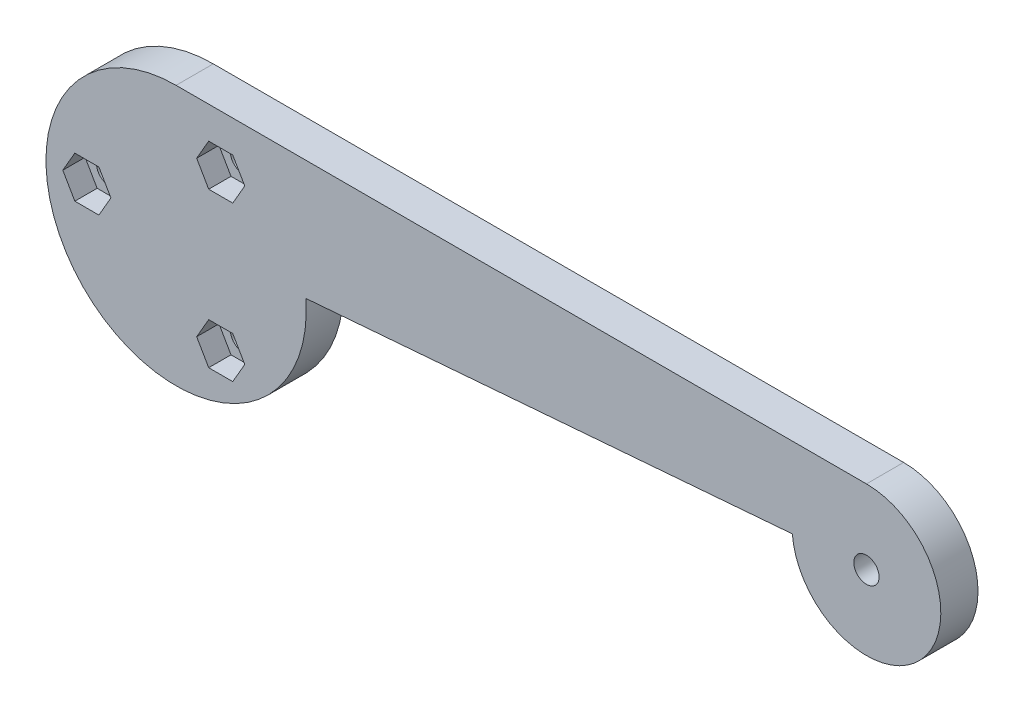
ISO-10303-21;
HEADER;
FILE_DESCRIPTION(('STEP AP214'),'2;1');
FILE_NAME('part.step','',(''),(''),'','','');
FILE_SCHEMA(('AUTOMOTIVE_DESIGN { 1 0 10303 214 1 1 1 1 }'));
ENDSEC;
DATA;
#1=APPLICATION_CONTEXT('core data for automotive mechanical design processes');
#2=APPLICATION_PROTOCOL_DEFINITION('international standard','automotive_design',2000,#1);
#3=PRODUCT_CONTEXT('',#1,'mechanical');
#4=PRODUCT('Part','Part','',(#3));
#5=PRODUCT_RELATED_PRODUCT_CATEGORY('part','',(#4));
#6=PRODUCT_DEFINITION_FORMATION('','',#4);
#7=PRODUCT_DEFINITION_CONTEXT('part definition',#1,'design');
#8=PRODUCT_DEFINITION('design','',#6,#7);
#9=PRODUCT_DEFINITION_SHAPE('','',#8);
#10=(LENGTH_UNIT() NAMED_UNIT(*) SI_UNIT(.MILLI.,.METRE.));
#11=(NAMED_UNIT(*) PLANE_ANGLE_UNIT() SI_UNIT($,.RADIAN.));
#12=(NAMED_UNIT(*) SI_UNIT($,.STERADIAN.) SOLID_ANGLE_UNIT());
#13=UNCERTAINTY_MEASURE_WITH_UNIT(LENGTH_MEASURE(1.E-05),#10,'distance_accuracy_value','');
#14=(GEOMETRIC_REPRESENTATION_CONTEXT(3) GLOBAL_UNCERTAINTY_ASSIGNED_CONTEXT((#13)) GLOBAL_UNIT_ASSIGNED_CONTEXT((#10,
#11,#12)) REPRESENTATION_CONTEXT('',''));
#15=CARTESIAN_POINT('',(0.,0.,0.));
#16=DIRECTION('',(0.,0.,1.));
#17=DIRECTION('',(1.,0.,0.));
#18=AXIS2_PLACEMENT_3D('',#15,#16,#17);
#19=CARTESIAN_POINT('',(5.9999999999999,-10.3923048454133,5.));
#20=DIRECTION('',(0.,0.,1.));
#21=DIRECTION('',(1.,0.,0.));
#22=AXIS2_PLACEMENT_3D('',#19,#20,#21);
#23=CYLINDRICAL_SURFACE('',#22,1.69999999999999);
#24=CARTESIAN_POINT('',(5.9999999999999,-10.3923048454133,0.));
#25=DIRECTION('',(0.,0.,1.));
#26=DIRECTION('',(1.,0.,0.));
#27=AXIS2_PLACEMENT_3D('',#24,#25,#26);
#28=CIRCLE('',#27,1.7);
#29=CARTESIAN_POINT('',(7.6999999999999,-10.3923048454133,0.));
#30=VERTEX_POINT('',#29);
#31=EDGE_CURVE('E289',#30,#30,#28,.T.);
#32=ORIENTED_EDGE('',*,*,#31,.F.);
#33=EDGE_LOOP('',(#32));
#34=FACE_BOUND('',#33,.T.);
#35=CARTESIAN_POINT('',(5.9999999999999,-10.3923048454133,2.));
#36=DIRECTION('',(0.,0.,1.));
#37=DIRECTION('',(1.,0.,0.));
#38=AXIS2_PLACEMENT_3D('',#35,#36,#37);
#39=CIRCLE('',#38,1.69999999999999);
#40=CARTESIAN_POINT('',(7.6999999999999,-10.3923048454133,2.));
#41=VERTEX_POINT('',#40);
#42=EDGE_CURVE('E37',#41,#41,#39,.F.);
#43=ORIENTED_EDGE('',*,*,#42,.F.);
#44=EDGE_LOOP('',(#43));
#45=FACE_BOUND('',#44,.T.);
#46=ADVANCED_FACE('F33',(#34,#45),#23,.F.);
#47=CARTESIAN_POINT('',(6.00000000000005,10.3923048454132,5.));
#48=DIRECTION('',(0.,0.,1.));
#49=DIRECTION('',(1.,0.,0.));
#50=AXIS2_PLACEMENT_3D('',#47,#48,#49);
#51=CYLINDRICAL_SURFACE('',#50,1.69999999999999);
#52=CARTESIAN_POINT('',(6.00000000000005,10.3923048454132,0.));
#53=DIRECTION('',(0.,0.,1.));
#54=DIRECTION('',(1.,0.,0.));
#55=AXIS2_PLACEMENT_3D('',#52,#53,#54);
#56=CIRCLE('',#55,1.7);
#57=CARTESIAN_POINT('',(7.70000000000005,10.3923048454132,0.));
#58=VERTEX_POINT('',#57);
#59=EDGE_CURVE('E292',#58,#58,#56,.T.);
#60=ORIENTED_EDGE('',*,*,#59,.F.);
#61=EDGE_LOOP('',(#60));
#62=FACE_BOUND('',#61,.T.);
#63=CARTESIAN_POINT('',(6.00000000000005,10.3923048454132,2.));
#64=DIRECTION('',(0.,0.,1.));
#65=DIRECTION('',(1.,0.,0.));
#66=AXIS2_PLACEMENT_3D('',#63,#64,#65);
#67=CIRCLE('',#66,1.69999999999999);
#68=CARTESIAN_POINT('',(7.70000000000004,10.3923048454132,2.));
#69=VERTEX_POINT('',#68);
#70=EDGE_CURVE('E279',#69,#69,#67,.F.);
#71=ORIENTED_EDGE('',*,*,#70,.F.);
#72=EDGE_LOOP('',(#71));
#73=FACE_BOUND('',#72,.T.);
#74=ADVANCED_FACE('F379',(#62,#73),#51,.F.);
#75=CARTESIAN_POINT('',(-12.,0.,5.));
#76=DIRECTION('',(0.,0.,1.));
#77=DIRECTION('',(1.,0.,0.));
#78=AXIS2_PLACEMENT_3D('',#75,#76,#77);
#79=CYLINDRICAL_SURFACE('',#78,1.69999999999999);
#80=CARTESIAN_POINT('',(-12.,0.,0.));
#81=DIRECTION('',(0.,0.,1.));
#82=DIRECTION('',(1.,0.,0.));
#83=AXIS2_PLACEMENT_3D('',#80,#81,#82);
#84=CIRCLE('',#83,1.7);
#85=CARTESIAN_POINT('',(-10.3,0.,0.));
#86=VERTEX_POINT('',#85);
#87=EDGE_CURVE('E344',#86,#86,#84,.T.);
#88=ORIENTED_EDGE('',*,*,#87,.F.);
#89=EDGE_LOOP('',(#88));
#90=FACE_BOUND('',#89,.T.);
#91=CARTESIAN_POINT('',(-12.,0.,2.));
#92=DIRECTION('',(0.,0.,1.));
#93=DIRECTION('',(1.,0.,0.));
#94=AXIS2_PLACEMENT_3D('',#91,#92,#93);
#95=CIRCLE('',#94,1.69999999999999);
#96=CARTESIAN_POINT('',(-10.3,0.,2.));
#97=VERTEX_POINT('',#96);
#98=EDGE_CURVE('E333',#97,#97,#95,.F.);
#99=ORIENTED_EDGE('',*,*,#98,.F.);
#100=EDGE_LOOP('',(#99));
#101=FACE_BOUND('',#100,.T.);
#102=ADVANCED_FACE('F381',(#90,#101),#79,.F.);
#103=CARTESIAN_POINT('',(0.,0.,5.));
#104=DIRECTION('',(0.,0.,-1.));
#105=DIRECTION('',(-1.,0.,0.));
#106=AXIS2_PLACEMENT_3D('',#103,#104,#105);
#107=CYLINDRICAL_SURFACE('',#106,17.5);
#108=CARTESIAN_POINT('',(0.,0.,0.));
#109=DIRECTION('',(0.,0.,1.));
#110=DIRECTION('',(1.,0.,0.));
#111=AXIS2_PLACEMENT_3D('',#108,#109,#110);
#112=CIRCLE('',#111,17.5);
#113=CARTESIAN_POINT('',(0.,17.5,0.));
#114=VERTEX_POINT('',#113);
#115=CARTESIAN_POINT('',(17.4431573607474,1.40934782371281,0.));
#116=VERTEX_POINT('',#115);
#117=EDGE_CURVE('E347',#114,#116,#112,.T.);
#118=ORIENTED_EDGE('',*,*,#117,.T.);
#119=DIRECTION('',(0.,0.,-1.));
#120=VECTOR('',#119,1.);
#121=CARTESIAN_POINT('',(17.4431573607474,1.40934782371281,5.));
#122=LINE('',#121,#120);
#123=CARTESIAN_POINT('',(17.4431573607474,1.40934782371281,5.));
#124=VERTEX_POINT('',#123);
#125=EDGE_CURVE('E11',#124,#116,#122,.T.);
#126=ORIENTED_EDGE('',*,*,#125,.F.);
#127=CARTESIAN_POINT('',(0.,0.,5.));
#128=DIRECTION('',(0.,0.,1.));
#129=DIRECTION('',(1.,0.,0.));
#130=AXIS2_PLACEMENT_3D('',#127,#128,#129);
#131=CIRCLE('',#130,17.5);
#132=CARTESIAN_POINT('',(0.,17.5,5.));
#133=VERTEX_POINT('',#132);
#134=EDGE_CURVE('E348',#133,#124,#131,.T.);
#135=ORIENTED_EDGE('',*,*,#134,.F.);
#136=DIRECTION('',(0.,0.,-1.));
#137=VECTOR('',#136,1.);
#138=CARTESIAN_POINT('',(0.,17.5,5.));
#139=LINE('',#138,#137);
#140=EDGE_CURVE('E358',#133,#114,#139,.T.);
#141=ORIENTED_EDGE('',*,*,#140,.T.);
#142=EDGE_LOOP('',(#118,#126,#135,#141));
#143=FACE_BOUND('',#142,.T.);
#144=ADVANCED_FACE('F35',(#143),#107,.T.);
#145=CARTESIAN_POINT('',(17.4431573607474,1.40934782371281,5.));
#146=DIRECTION('',(-0.0805341613550145,0.996751849185566,0.));
#147=DIRECTION('',(-0.996751849185566,-0.0805341613550145,0.));
#148=AXIS2_PLACEMENT_3D('',#145,#146,#147);
#149=PLANE('',#148);
#150=DIRECTION('',(0.996751849185565,0.0805341613550145,0.));
#151=VECTOR('',#150,1.);
#152=CARTESIAN_POINT('',(17.4431573607474,1.40934782371281,0.));
#153=LINE('',#152,#151);
#154=CARTESIAN_POINT('',(82.8581686837672,6.69465838644989,0.));
#155=VERTEX_POINT('',#154);
#156=EDGE_CURVE('E361',#116,#155,#153,.T.);
#157=ORIENTED_EDGE('',*,*,#156,.T.);
#158=DIRECTION('',(0.,0.,-1.));
#159=VECTOR('',#158,1.);
#160=CARTESIAN_POINT('',(82.8581686837672,6.69465838644989,5.));
#161=LINE('',#160,#159);
#162=CARTESIAN_POINT('',(82.8581686837672,6.69465838644989,5.));
#163=VERTEX_POINT('',#162);
#164=EDGE_CURVE('E42',#163,#155,#161,.T.);
#165=ORIENTED_EDGE('',*,*,#164,.F.);
#166=DIRECTION('',(0.996751849185565,0.0805341613550145,0.));
#167=VECTOR('',#166,1.);
#168=CARTESIAN_POINT('',(17.4431573607474,1.40934782371281,5.));
#169=LINE('',#168,#167);
#170=EDGE_CURVE('E351',#124,#163,#169,.T.);
#171=ORIENTED_EDGE('',*,*,#170,.F.);
#172=ORIENTED_EDGE('',*,*,#125,.T.);
#173=EDGE_LOOP('',(#157,#165,#171,#172));
#174=FACE_BOUND('',#173,.T.);
#175=ADVANCED_FACE('F437',(#174),#149,.F.);
#176=CARTESIAN_POINT('',(92.8256871756229,7.5,5.));
#177=DIRECTION('',(0.,0.,-1.));
#178=DIRECTION('',(-1.,0.,0.));
#179=AXIS2_PLACEMENT_3D('',#176,#177,#178);
#180=CYLINDRICAL_SURFACE('',#179,10.);
#181=CARTESIAN_POINT('',(92.8256871756229,7.5,0.));
#182=DIRECTION('',(0.,0.,1.));
#183=DIRECTION('',(-1.,0.,0.));
#184=AXIS2_PLACEMENT_3D('',#181,#182,#183);
#185=CIRCLE('',#184,10.);
#186=CARTESIAN_POINT('',(92.8256871756229,17.5,0.));
#187=VERTEX_POINT('',#186);
#188=EDGE_CURVE('E363',#155,#187,#185,.T.);
#189=ORIENTED_EDGE('',*,*,#188,.T.);
#190=DIRECTION('',(0.,0.,-1.));
#191=VECTOR('',#190,1.);
#192=CARTESIAN_POINT('',(92.8256871756229,17.5,5.));
#193=LINE('',#192,#191);
#194=CARTESIAN_POINT('',(92.8256871756229,17.5,5.));
#195=VERTEX_POINT('',#194);
#196=EDGE_CURVE('E368',#195,#187,#193,.T.);
#197=ORIENTED_EDGE('',*,*,#196,.F.);
#198=CARTESIAN_POINT('',(92.8256871756229,7.5,5.));
#199=DIRECTION('',(0.,0.,1.));
#200=DIRECTION('',(-1.,0.,0.));
#201=AXIS2_PLACEMENT_3D('',#198,#199,#200);
#202=CIRCLE('',#201,10.);
#203=EDGE_CURVE('E354',#163,#195,#202,.T.);
#204=ORIENTED_EDGE('',*,*,#203,.F.);
#205=ORIENTED_EDGE('',*,*,#164,.T.);
#206=EDGE_LOOP('',(#189,#197,#204,#205));
#207=FACE_BOUND('',#206,.T.);
#208=ADVANCED_FACE('F434',(#207),#180,.T.);
#209=CARTESIAN_POINT('',(0.,17.5,5.));
#210=DIRECTION('',(0.,-1.,0.));
#211=DIRECTION('',(0.,0.,-1.));
#212=AXIS2_PLACEMENT_3D('',#209,#210,#211);
#213=PLANE('',#212);
#214=DIRECTION('',(-1.,0.,0.));
#215=VECTOR('',#214,1.);
#216=CARTESIAN_POINT('',(0.,17.5,0.));
#217=LINE('',#216,#215);
#218=EDGE_CURVE('E352',#187,#114,#217,.T.);
#219=ORIENTED_EDGE('',*,*,#218,.T.);
#220=ORIENTED_EDGE('',*,*,#140,.F.);
#221=DIRECTION('',(-1.,0.,0.));
#222=VECTOR('',#221,1.);
#223=CARTESIAN_POINT('',(0.,17.5,5.));
#224=LINE('',#223,#222);
#225=EDGE_CURVE('E356',#195,#133,#224,.T.);
#226=ORIENTED_EDGE('',*,*,#225,.F.);
#227=ORIENTED_EDGE('',*,*,#196,.T.);
#228=EDGE_LOOP('',(#219,#220,#226,#227));
#229=FACE_BOUND('',#228,.T.);
#230=ADVANCED_FACE('F427',(#229),#213,.F.);
#231=CARTESIAN_POINT('',(0.,0.,5.));
#232=DIRECTION('',(0.,0.,1.));
#233=DIRECTION('',(1.,0.,0.));
#234=AXIS2_PLACEMENT_3D('',#231,#232,#233);
#235=PLANE('',#234);
#236=CARTESIAN_POINT('',(92.8256871756229,7.5,5.));
#237=DIRECTION('',(0.,0.,1.));
#238=DIRECTION('',(1.,0.,0.));
#239=AXIS2_PLACEMENT_3D('',#236,#237,#238);
#240=CIRCLE('',#239,1.69999999999999);
#241=CARTESIAN_POINT('',(94.5256871756229,7.5,5.));
#242=VERTEX_POINT('',#241);
#243=EDGE_CURVE('E681',#242,#242,#240,.T.);
#244=ORIENTED_EDGE('',*,*,#243,.F.);
#245=EDGE_LOOP('',(#244));
#246=FACE_BOUND('',#245,.T.);
#247=DIRECTION('',(-0.500000000000008,-0.866025403784434,0.));
#248=VECTOR('',#247,1.);
#249=CARTESIAN_POINT('',(4.38341924626897,-7.5923048454133,5.));
#250=LINE('',#249,#248);
#251=CARTESIAN_POINT('',(4.38341924626897,-7.5923048454133,5.));
#252=VERTEX_POINT('',#251);
#253=CARTESIAN_POINT('',(2.766838492538,-10.3923048454133,5.));
#254=VERTEX_POINT('',#253);
#255=EDGE_CURVE('E50',#252,#254,#250,.T.);
#256=ORIENTED_EDGE('',*,*,#255,.F.);
#257=DIRECTION('',(-1.,0.,0.));
#258=VECTOR('',#257,1.);
#259=CARTESIAN_POINT('',(7.61658075373088,-7.59230484541333,5.));
#260=LINE('',#259,#258);
#261=CARTESIAN_POINT('',(7.61658075373088,-7.59230484541333,5.));
#262=VERTEX_POINT('',#261);
#263=EDGE_CURVE('E206',#262,#252,#260,.T.);
#264=ORIENTED_EDGE('',*,*,#263,.F.);
#265=DIRECTION('',(-0.499999999999992,0.866025403784443,0.));
#266=VECTOR('',#265,1.);
#267=CARTESIAN_POINT('',(9.23316150746181,-10.3923048454134,5.));
#268=LINE('',#267,#266);
#269=CARTESIAN_POINT('',(9.23316150746181,-10.3923048454134,5.));
#270=VERTEX_POINT('',#269);
#271=EDGE_CURVE('E209',#270,#262,#268,.T.);
#272=ORIENTED_EDGE('',*,*,#271,.F.);
#273=DIRECTION('',(0.500000000000008,0.866025403784434,0.));
#274=VECTOR('',#273,1.);
#275=CARTESIAN_POINT('',(7.61658075373083,-13.1923048454133,5.));
#276=LINE('',#275,#274);
#277=CARTESIAN_POINT('',(7.61658075373083,-13.1923048454133,5.));
#278=VERTEX_POINT('',#277);
#279=EDGE_CURVE('E228',#278,#270,#276,.T.);
#280=ORIENTED_EDGE('',*,*,#279,.F.);
#281=DIRECTION('',(1.,0.,0.));
#282=VECTOR('',#281,1.);
#283=CARTESIAN_POINT('',(4.38341924626893,-13.1923048454133,5.));
#284=LINE('',#283,#282);
#285=CARTESIAN_POINT('',(4.38341924626893,-13.1923048454133,5.));
#286=VERTEX_POINT('',#285);
#287=EDGE_CURVE('E225',#286,#278,#284,.T.);
#288=ORIENTED_EDGE('',*,*,#287,.F.);
#289=DIRECTION('',(0.499999999999992,-0.866025403784443,0.));
#290=VECTOR('',#289,1.);
#291=CARTESIAN_POINT('',(2.766838492538,-10.3923048454133,5.));
#292=LINE('',#291,#290);
#293=EDGE_CURVE('E223',#254,#286,#292,.T.);
#294=ORIENTED_EDGE('',*,*,#293,.F.);
#295=EDGE_LOOP('',(#256,#264,#272,#280,#288,#294));
#296=FACE_BOUND('',#295,.T.);
#297=DIRECTION('',(1.,0.,0.));
#298=VECTOR('',#297,1.);
#299=CARTESIAN_POINT('',(4.38341924626908,7.59230484541324,5.));
#300=LINE('',#299,#298);
#301=CARTESIAN_POINT('',(4.38341924626908,7.59230484541324,5.));
#302=VERTEX_POINT('',#301);
#303=CARTESIAN_POINT('',(7.61658075373099,7.59230484541323,5.));
#304=VERTEX_POINT('',#303);
#305=EDGE_CURVE('E58',#302,#304,#300,.T.);
#306=ORIENTED_EDGE('',*,*,#305,.F.);
#307=DIRECTION('',(0.499999999999995,-0.866025403784441,0.));
#308=VECTOR('',#307,1.);
#309=CARTESIAN_POINT('',(2.76683849253814,10.3923048454133,5.));
#310=LINE('',#309,#308);
#311=CARTESIAN_POINT('',(2.76683849253814,10.3923048454133,5.));
#312=VERTEX_POINT('',#311);
#313=EDGE_CURVE('E246',#312,#302,#310,.T.);
#314=ORIENTED_EDGE('',*,*,#313,.F.);
#315=DIRECTION('',(-0.500000000000004,-0.866025403784436,0.));
#316=VECTOR('',#315,1.);
#317=CARTESIAN_POINT('',(4.38341924626911,13.1923048454132,5.));
#318=LINE('',#317,#316);
#319=CARTESIAN_POINT('',(4.38341924626911,13.1923048454132,5.));
#320=VERTEX_POINT('',#319);
#321=EDGE_CURVE('E272',#320,#312,#318,.T.);
#322=ORIENTED_EDGE('',*,*,#321,.F.);
#323=DIRECTION('',(-1.,0.,0.));
#324=VECTOR('',#323,1.);
#325=CARTESIAN_POINT('',(7.61658075373101,13.1923048454132,5.));
#326=LINE('',#325,#324);
#327=CARTESIAN_POINT('',(7.61658075373101,13.1923048454132,5.));
#328=VERTEX_POINT('',#327);
#329=EDGE_CURVE('E269',#328,#320,#326,.T.);
#330=ORIENTED_EDGE('',*,*,#329,.F.);
#331=DIRECTION('',(-0.499999999999996,0.866025403784441,0.));
#332=VECTOR('',#331,1.);
#333=CARTESIAN_POINT('',(9.23316150746195,10.3923048454132,5.));
#334=LINE('',#333,#332);
#335=CARTESIAN_POINT('',(9.23316150746195,10.3923048454132,5.));
#336=VERTEX_POINT('',#335);
#337=EDGE_CURVE('E266',#336,#328,#334,.T.);
#338=ORIENTED_EDGE('',*,*,#337,.F.);
#339=DIRECTION('',(0.500000000000004,0.866025403784436,0.));
#340=VECTOR('',#339,1.);
#341=CARTESIAN_POINT('',(7.61658075373099,7.59230484541323,5.));
#342=LINE('',#341,#340);
#343=EDGE_CURVE('E263',#304,#336,#342,.T.);
#344=ORIENTED_EDGE('',*,*,#343,.F.);
#345=EDGE_LOOP('',(#306,#314,#322,#330,#338,#344));
#346=FACE_BOUND('',#345,.T.);
#347=DIRECTION('',(-0.500000000000001,0.866025403784438,0.));
#348=VECTOR('',#347,1.);
#349=CARTESIAN_POINT('',(-8.76683849253809,0.,5.));
#350=LINE('',#349,#348);
#351=CARTESIAN_POINT('',(-8.76683849253809,0.,5.));
#352=VERTEX_POINT('',#351);
#353=CARTESIAN_POINT('',(-10.383419246269,2.8,5.));
#354=VERTEX_POINT('',#353);
#355=EDGE_CURVE('E295',#352,#354,#350,.T.);
#356=ORIENTED_EDGE('',*,*,#355,.F.);
#357=DIRECTION('',(0.500000000000001,0.866025403784438,0.));
#358=VECTOR('',#357,1.);
#359=CARTESIAN_POINT('',(-10.383419246269,-2.8,5.));
#360=LINE('',#359,#358);
#361=CARTESIAN_POINT('',(-10.383419246269,-2.8,5.));
#362=VERTEX_POINT('',#361);
#363=EDGE_CURVE('E300',#362,#352,#360,.T.);
#364=ORIENTED_EDGE('',*,*,#363,.F.);
#365=DIRECTION('',(1.,0.,0.));
#366=VECTOR('',#365,1.);
#367=CARTESIAN_POINT('',(-13.616580753731,-2.8,5.));
#368=LINE('',#367,#366);
#369=CARTESIAN_POINT('',(-13.616580753731,-2.8,5.));
#370=VERTEX_POINT('',#369);
#371=EDGE_CURVE('E326',#370,#362,#368,.T.);
#372=ORIENTED_EDGE('',*,*,#371,.F.);
#373=DIRECTION('',(0.5,-0.866025403784438,0.));
#374=VECTOR('',#373,1.);
#375=CARTESIAN_POINT('',(-15.2331615074619,0.,5.));
#376=LINE('',#375,#374);
#377=CARTESIAN_POINT('',(-15.2331615074619,0.,5.));
#378=VERTEX_POINT('',#377);
#379=EDGE_CURVE('E323',#378,#370,#376,.T.);
#380=ORIENTED_EDGE('',*,*,#379,.F.);
#381=DIRECTION('',(-0.5,-0.866025403784438,0.));
#382=VECTOR('',#381,1.);
#383=CARTESIAN_POINT('',(-13.616580753731,2.8,5.));
#384=LINE('',#383,#382);
#385=CARTESIAN_POINT('',(-13.616580753731,2.8,5.));
#386=VERTEX_POINT('',#385);
#387=EDGE_CURVE('E320',#386,#378,#384,.T.);
#388=ORIENTED_EDGE('',*,*,#387,.F.);
#389=DIRECTION('',(-1.,0.,0.));
#390=VECTOR('',#389,1.);
#391=CARTESIAN_POINT('',(-10.383419246269,2.8,5.));
#392=LINE('',#391,#390);
#393=EDGE_CURVE('E317',#354,#386,#392,.T.);
#394=ORIENTED_EDGE('',*,*,#393,.F.);
#395=EDGE_LOOP('',(#356,#364,#372,#380,#388,#394));
#396=FACE_BOUND('',#395,.T.);
#397=ORIENTED_EDGE('',*,*,#134,.T.);
#398=ORIENTED_EDGE('',*,*,#170,.T.);
#399=ORIENTED_EDGE('',*,*,#203,.T.);
#400=ORIENTED_EDGE('',*,*,#225,.T.);
#401=EDGE_LOOP('',(#397,#398,#399,#400));
#402=FACE_BOUND('',#401,.T.);
#403=ADVANCED_FACE('F424',(#246,#296,#346,#396,#402),#235,.T.);
#404=CARTESIAN_POINT('',(0.,0.,0.));
#405=DIRECTION('',(0.,0.,1.));
#406=DIRECTION('',(1.,0.,0.));
#407=AXIS2_PLACEMENT_3D('',#404,#405,#406);
#408=PLANE('',#407);
#409=CARTESIAN_POINT('',(92.8256871756229,7.5,0.));
#410=DIRECTION('',(0.,0.,1.));
#411=DIRECTION('',(1.,0.,0.));
#412=AXIS2_PLACEMENT_3D('',#409,#410,#411);
#413=CIRCLE('',#412,1.69999999999999);
#414=CARTESIAN_POINT('',(94.5256871756229,7.5,0.));
#415=VERTEX_POINT('',#414);
#416=EDGE_CURVE('E212',#415,#415,#413,.T.);
#417=ORIENTED_EDGE('',*,*,#416,.T.);
#418=EDGE_LOOP('',(#417));
#419=FACE_BOUND('',#418,.T.);
#420=ORIENTED_EDGE('',*,*,#31,.T.);
#421=EDGE_LOOP('',(#420));
#422=FACE_BOUND('',#421,.T.);
#423=ORIENTED_EDGE('',*,*,#59,.T.);
#424=EDGE_LOOP('',(#423));
#425=FACE_BOUND('',#424,.T.);
#426=ORIENTED_EDGE('',*,*,#87,.T.);
#427=EDGE_LOOP('',(#426));
#428=FACE_BOUND('',#427,.T.);
#429=ORIENTED_EDGE('',*,*,#117,.F.);
#430=ORIENTED_EDGE('',*,*,#218,.F.);
#431=ORIENTED_EDGE('',*,*,#188,.F.);
#432=ORIENTED_EDGE('',*,*,#156,.F.);
#433=EDGE_LOOP('',(#429,#430,#431,#432));
#434=FACE_BOUND('',#433,.T.);
#435=ADVANCED_FACE('F399',(#419,#422,#425,#428,#434),#408,.F.);
#436=CARTESIAN_POINT('',(0.,0.,2.));
#437=DIRECTION('',(0.,0.,1.));
#438=DIRECTION('',(1.,0.,0.));
#439=AXIS2_PLACEMENT_3D('',#436,#437,#438);
#440=PLANE('',#439);
#441=DIRECTION('',(-0.500000000000001,0.866025403784438,0.));
#442=VECTOR('',#441,1.);
#443=CARTESIAN_POINT('',(-8.76683849253809,0.,2.));
#444=LINE('',#443,#442);
#445=CARTESIAN_POINT('',(-8.76683849253809,0.,2.));
#446=VERTEX_POINT('',#445);
#447=CARTESIAN_POINT('',(-10.383419246269,2.8,2.));
#448=VERTEX_POINT('',#447);
#449=EDGE_CURVE('E296',#446,#448,#444,.T.);
#450=ORIENTED_EDGE('',*,*,#449,.T.);
#451=DIRECTION('',(-1.,0.,0.));
#452=VECTOR('',#451,1.);
#453=CARTESIAN_POINT('',(-10.383419246269,2.8,2.));
#454=LINE('',#453,#452);
#455=CARTESIAN_POINT('',(-13.616580753731,2.8,2.));
#456=VERTEX_POINT('',#455);
#457=EDGE_CURVE('E299',#448,#456,#454,.T.);
#458=ORIENTED_EDGE('',*,*,#457,.T.);
#459=DIRECTION('',(-0.5,-0.866025403784438,0.));
#460=VECTOR('',#459,1.);
#461=CARTESIAN_POINT('',(-13.616580753731,2.8,2.));
#462=LINE('',#461,#460);
#463=CARTESIAN_POINT('',(-15.2331615074619,0.,2.));
#464=VERTEX_POINT('',#463);
#465=EDGE_CURVE('E303',#456,#464,#462,.T.);
#466=ORIENTED_EDGE('',*,*,#465,.T.);
#467=DIRECTION('',(0.5,-0.866025403784438,0.));
#468=VECTOR('',#467,1.);
#469=CARTESIAN_POINT('',(-15.2331615074619,0.,2.));
#470=LINE('',#469,#468);
#471=CARTESIAN_POINT('',(-13.616580753731,-2.8,2.));
#472=VERTEX_POINT('',#471);
#473=EDGE_CURVE('E306',#464,#472,#470,.T.);
#474=ORIENTED_EDGE('',*,*,#473,.T.);
#475=DIRECTION('',(1.,0.,0.));
#476=VECTOR('',#475,1.);
#477=CARTESIAN_POINT('',(-13.616580753731,-2.8,2.));
#478=LINE('',#477,#476);
#479=CARTESIAN_POINT('',(-10.383419246269,-2.8,2.));
#480=VERTEX_POINT('',#479);
#481=EDGE_CURVE('E309',#472,#480,#478,.T.);
#482=ORIENTED_EDGE('',*,*,#481,.T.);
#483=DIRECTION('',(0.500000000000001,0.866025403784438,0.));
#484=VECTOR('',#483,1.);
#485=CARTESIAN_POINT('',(-10.383419246269,-2.8,2.));
#486=LINE('',#485,#484);
#487=EDGE_CURVE('E312',#480,#446,#486,.T.);
#488=ORIENTED_EDGE('',*,*,#487,.T.);
#489=EDGE_LOOP('',(#450,#458,#466,#474,#482,#488));
#490=FACE_BOUND('',#489,.T.);
#491=ORIENTED_EDGE('',*,*,#98,.T.);
#492=EDGE_LOOP('',(#491));
#493=FACE_BOUND('',#492,.T.);
#494=ADVANCED_FACE('F395',(#490,#493),#440,.T.);
#495=CARTESIAN_POINT('',(-8.76683849253809,0.,2.));
#496=DIRECTION('',(0.866025403784438,0.500000000000001,0.));
#497=DIRECTION('',(-0.500000000000001,0.866025403784438,0.));
#498=AXIS2_PLACEMENT_3D('',#495,#496,#497);
#499=PLANE('',#498);
#500=ORIENTED_EDGE('',*,*,#355,.T.);
#501=DIRECTION('',(0.,0.,1.));
#502=VECTOR('',#501,1.);
#503=CARTESIAN_POINT('',(-10.383419246269,2.8,2.));
#504=LINE('',#503,#502);
#505=EDGE_CURVE('E315',#448,#354,#504,.T.);
#506=ORIENTED_EDGE('',*,*,#505,.F.);
#507=ORIENTED_EDGE('',*,*,#449,.F.);
#508=DIRECTION('',(0.,0.,1.));
#509=VECTOR('',#508,1.);
#510=CARTESIAN_POINT('',(-8.76683849253809,0.,2.));
#511=LINE('',#510,#509);
#512=EDGE_CURVE('E331',#446,#352,#511,.T.);
#513=ORIENTED_EDGE('',*,*,#512,.T.);
#514=EDGE_LOOP('',(#500,#506,#507,#513));
#515=FACE_BOUND('',#514,.T.);
#516=ADVANCED_FACE('F398',(#515),#499,.F.);
#517=CARTESIAN_POINT('',(-10.383419246269,-2.8,2.));
#518=DIRECTION('',(0.866025403784438,-0.500000000000001,0.));
#519=DIRECTION('',(0.500000000000001,0.866025403784438,0.));
#520=AXIS2_PLACEMENT_3D('',#517,#518,#519);
#521=PLANE('',#520);
#522=ORIENTED_EDGE('',*,*,#363,.T.);
#523=ORIENTED_EDGE('',*,*,#512,.F.);
#524=ORIENTED_EDGE('',*,*,#487,.F.);
#525=DIRECTION('',(0.,0.,1.));
#526=VECTOR('',#525,1.);
#527=CARTESIAN_POINT('',(-10.383419246269,-2.8,2.));
#528=LINE('',#527,#526);
#529=EDGE_CURVE('E334',#480,#362,#528,.T.);
#530=ORIENTED_EDGE('',*,*,#529,.T.);
#531=EDGE_LOOP('',(#522,#523,#524,#530));
#532=FACE_BOUND('',#531,.T.);
#533=ADVANCED_FACE('F401',(#532),#521,.F.);
#534=CARTESIAN_POINT('',(-13.616580753731,-2.8,2.));
#535=DIRECTION('',(0.,-1.,0.));
#536=DIRECTION('',(0.,0.,-1.));
#537=AXIS2_PLACEMENT_3D('',#534,#535,#536);
#538=PLANE('',#537);
#539=ORIENTED_EDGE('',*,*,#371,.T.);
#540=ORIENTED_EDGE('',*,*,#529,.F.);
#541=ORIENTED_EDGE('',*,*,#481,.F.);
#542=DIRECTION('',(0.,0.,1.));
#543=VECTOR('',#542,1.);
#544=CARTESIAN_POINT('',(-13.616580753731,-2.8,2.));
#545=LINE('',#544,#543);
#546=EDGE_CURVE('E336',#472,#370,#545,.T.);
#547=ORIENTED_EDGE('',*,*,#546,.T.);
#548=EDGE_LOOP('',(#539,#540,#541,#547));
#549=FACE_BOUND('',#548,.T.);
#550=ADVANCED_FACE('F404',(#549),#538,.F.);
#551=CARTESIAN_POINT('',(-15.2331615074619,0.,2.));
#552=DIRECTION('',(-0.866025403784439,-0.5,0.));
#553=DIRECTION('',(0.5,-0.866025403784439,0.));
#554=AXIS2_PLACEMENT_3D('',#551,#552,#553);
#555=PLANE('',#554);
#556=ORIENTED_EDGE('',*,*,#379,.T.);
#557=ORIENTED_EDGE('',*,*,#546,.F.);
#558=ORIENTED_EDGE('',*,*,#473,.F.);
#559=DIRECTION('',(0.,0.,1.));
#560=VECTOR('',#559,1.);
#561=CARTESIAN_POINT('',(-15.2331615074619,0.,2.));
#562=LINE('',#561,#560);
#563=EDGE_CURVE('E338',#464,#378,#562,.T.);
#564=ORIENTED_EDGE('',*,*,#563,.T.);
#565=EDGE_LOOP('',(#556,#557,#558,#564));
#566=FACE_BOUND('',#565,.T.);
#567=ADVANCED_FACE('F408',(#566),#555,.F.);
#568=CARTESIAN_POINT('',(-13.616580753731,2.8,2.));
#569=DIRECTION('',(-0.866025403784439,0.5,0.));
#570=DIRECTION('',(-0.5,-0.866025403784439,0.));
#571=AXIS2_PLACEMENT_3D('',#568,#569,#570);
#572=PLANE('',#571);
#573=ORIENTED_EDGE('',*,*,#387,.T.);
#574=ORIENTED_EDGE('',*,*,#563,.F.);
#575=ORIENTED_EDGE('',*,*,#465,.F.);
#576=DIRECTION('',(0.,0.,1.));
#577=VECTOR('',#576,1.);
#578=CARTESIAN_POINT('',(-13.616580753731,2.8,2.));
#579=LINE('',#578,#577);
#580=EDGE_CURVE('E340',#456,#386,#579,.T.);
#581=ORIENTED_EDGE('',*,*,#580,.T.);
#582=EDGE_LOOP('',(#573,#574,#575,#581));
#583=FACE_BOUND('',#582,.T.);
#584=ADVANCED_FACE('F412',(#583),#572,.F.);
#585=CARTESIAN_POINT('',(-10.383419246269,2.8,2.));
#586=DIRECTION('',(0.,1.,0.));
#587=DIRECTION('',(0.,0.,1.));
#588=AXIS2_PLACEMENT_3D('',#585,#586,#587);
#589=PLANE('',#588);
#590=ORIENTED_EDGE('',*,*,#393,.T.);
#591=ORIENTED_EDGE('',*,*,#580,.F.);
#592=ORIENTED_EDGE('',*,*,#457,.F.);
#593=ORIENTED_EDGE('',*,*,#505,.T.);
#594=EDGE_LOOP('',(#590,#591,#592,#593));
#595=FACE_BOUND('',#594,.T.);
#596=ADVANCED_FACE('F416',(#595),#589,.F.);
#597=CARTESIAN_POINT('',(0.,0.,2.));
#598=DIRECTION('',(0.,0.,1.));
#599=DIRECTION('',(-0.500000000000004,-0.866025403784436,0.));
#600=AXIS2_PLACEMENT_3D('',#597,#598,#599);
#601=PLANE('',#600);
#602=DIRECTION('',(1.,0.,0.));
#603=VECTOR('',#602,1.);
#604=CARTESIAN_POINT('',(4.38341924626908,7.59230484541324,2.));
#605=LINE('',#604,#603);
#606=CARTESIAN_POINT('',(4.38341924626908,7.59230484541324,2.));
#607=VERTEX_POINT('',#606);
#608=CARTESIAN_POINT('',(7.61658075373099,7.59230484541323,2.));
#609=VERTEX_POINT('',#608);
#610=EDGE_CURVE('E242',#607,#609,#605,.T.);
#611=ORIENTED_EDGE('',*,*,#610,.T.);
#612=DIRECTION('',(0.500000000000004,0.866025403784436,0.));
#613=VECTOR('',#612,1.);
#614=CARTESIAN_POINT('',(7.61658075373099,7.59230484541323,2.));
#615=LINE('',#614,#613);
#616=CARTESIAN_POINT('',(9.23316150746195,10.3923048454132,2.));
#617=VERTEX_POINT('',#616);
#618=EDGE_CURVE('E245',#609,#617,#615,.T.);
#619=ORIENTED_EDGE('',*,*,#618,.T.);
#620=DIRECTION('',(-0.499999999999996,0.866025403784441,0.));
#621=VECTOR('',#620,1.);
#622=CARTESIAN_POINT('',(9.23316150746195,10.3923048454132,2.));
#623=LINE('',#622,#621);
#624=CARTESIAN_POINT('',(7.61658075373101,13.1923048454132,2.));
#625=VERTEX_POINT('',#624);
#626=EDGE_CURVE('E249',#617,#625,#623,.T.);
#627=ORIENTED_EDGE('',*,*,#626,.T.);
#628=DIRECTION('',(-1.,0.,0.));
#629=VECTOR('',#628,1.);
#630=CARTESIAN_POINT('',(7.61658075373101,13.1923048454132,2.));
#631=LINE('',#630,#629);
#632=CARTESIAN_POINT('',(4.38341924626911,13.1923048454132,2.));
#633=VERTEX_POINT('',#632);
#634=EDGE_CURVE('E252',#625,#633,#631,.T.);
#635=ORIENTED_EDGE('',*,*,#634,.T.);
#636=DIRECTION('',(-0.500000000000004,-0.866025403784436,0.));
#637=VECTOR('',#636,1.);
#638=CARTESIAN_POINT('',(4.38341924626911,13.1923048454132,2.));
#639=LINE('',#638,#637);
#640=CARTESIAN_POINT('',(2.76683849253814,10.3923048454133,2.));
#641=VERTEX_POINT('',#640);
#642=EDGE_CURVE('E255',#633,#641,#639,.T.);
#643=ORIENTED_EDGE('',*,*,#642,.T.);
#644=DIRECTION('',(0.499999999999995,-0.866025403784441,0.));
#645=VECTOR('',#644,1.);
#646=CARTESIAN_POINT('',(2.76683849253814,10.3923048454133,2.));
#647=LINE('',#646,#645);
#648=EDGE_CURVE('E258',#641,#607,#647,.T.);
#649=ORIENTED_EDGE('',*,*,#648,.T.);
#650=EDGE_LOOP('',(#611,#619,#627,#635,#643,#649));
#651=FACE_BOUND('',#650,.T.);
#652=ORIENTED_EDGE('',*,*,#70,.T.);
#653=EDGE_LOOP('',(#652));
#654=FACE_BOUND('',#653,.T.);
#655=ADVANCED_FACE('F377',(#651,#654),#601,.T.);
#656=CARTESIAN_POINT('',(4.38341924626908,7.59230484541324,2.));
#657=DIRECTION('',(0.,-1.,0.));
#658=DIRECTION('',(1.,0.,0.));
#659=AXIS2_PLACEMENT_3D('',#656,#657,#658);
#660=PLANE('',#659);
#661=ORIENTED_EDGE('',*,*,#305,.T.);
#662=DIRECTION('',(0.,0.,1.));
#663=VECTOR('',#662,1.);
#664=CARTESIAN_POINT('',(7.61658075373099,7.59230484541323,2.));
#665=LINE('',#664,#663);
#666=EDGE_CURVE('E261',#609,#304,#665,.T.);
#667=ORIENTED_EDGE('',*,*,#666,.F.);
#668=ORIENTED_EDGE('',*,*,#610,.F.);
#669=DIRECTION('',(0.,0.,1.));
#670=VECTOR('',#669,1.);
#671=CARTESIAN_POINT('',(4.38341924626908,7.59230484541324,2.));
#672=LINE('',#671,#670);
#673=EDGE_CURVE('E277',#607,#302,#672,.T.);
#674=ORIENTED_EDGE('',*,*,#673,.T.);
#675=EDGE_LOOP('',(#661,#667,#668,#674));
#676=FACE_BOUND('',#675,.T.);
#677=ADVANCED_FACE('F529',(#676),#660,.F.);
#678=CARTESIAN_POINT('',(2.76683849253814,10.3923048454133,2.));
#679=DIRECTION('',(-0.866025403784441,-0.499999999999995,0.));
#680=DIRECTION('',(0.499999999999995,-0.866025403784441,0.));
#681=AXIS2_PLACEMENT_3D('',#678,#679,#680);
#682=PLANE('',#681);
#683=ORIENTED_EDGE('',*,*,#313,.T.);
#684=ORIENTED_EDGE('',*,*,#673,.F.);
#685=ORIENTED_EDGE('',*,*,#648,.F.);
#686=DIRECTION('',(0.,0.,1.));
#687=VECTOR('',#686,1.);
#688=CARTESIAN_POINT('',(2.76683849253814,10.3923048454133,2.));
#689=LINE('',#688,#687);
#690=EDGE_CURVE('E280',#641,#312,#689,.T.);
#691=ORIENTED_EDGE('',*,*,#690,.T.);
#692=EDGE_LOOP('',(#683,#684,#685,#691));
#693=FACE_BOUND('',#692,.T.);
#694=ADVANCED_FACE('F539',(#693),#682,.F.);
#695=CARTESIAN_POINT('',(4.38341924626911,13.1923048454132,2.));
#696=DIRECTION('',(-0.866025403784436,0.500000000000004,0.));
#697=DIRECTION('',(-0.500000000000004,-0.866025403784436,0.));
#698=AXIS2_PLACEMENT_3D('',#695,#696,#697);
#699=PLANE('',#698);
#700=ORIENTED_EDGE('',*,*,#321,.T.);
#701=ORIENTED_EDGE('',*,*,#690,.F.);
#702=ORIENTED_EDGE('',*,*,#642,.F.);
#703=DIRECTION('',(0.,0.,1.));
#704=VECTOR('',#703,1.);
#705=CARTESIAN_POINT('',(4.38341924626911,13.1923048454132,2.));
#706=LINE('',#705,#704);
#707=EDGE_CURVE('E282',#633,#320,#706,.T.);
#708=ORIENTED_EDGE('',*,*,#707,.T.);
#709=EDGE_LOOP('',(#700,#701,#702,#708));
#710=FACE_BOUND('',#709,.T.);
#711=ADVANCED_FACE('F547',(#710),#699,.F.);
#712=CARTESIAN_POINT('',(7.61658075373101,13.1923048454132,2.));
#713=DIRECTION('',(0.,1.,0.));
#714=DIRECTION('',(-1.,0.,0.));
#715=AXIS2_PLACEMENT_3D('',#712,#713,#714);
#716=PLANE('',#715);
#717=ORIENTED_EDGE('',*,*,#329,.T.);
#718=ORIENTED_EDGE('',*,*,#707,.F.);
#719=ORIENTED_EDGE('',*,*,#634,.F.);
#720=DIRECTION('',(0.,0.,1.));
#721=VECTOR('',#720,1.);
#722=CARTESIAN_POINT('',(7.61658075373101,13.1923048454132,2.));
#723=LINE('',#722,#721);
#724=EDGE_CURVE('E284',#625,#328,#723,.T.);
#725=ORIENTED_EDGE('',*,*,#724,.T.);
#726=EDGE_LOOP('',(#717,#718,#719,#725));
#727=FACE_BOUND('',#726,.T.);
#728=ADVANCED_FACE('F557',(#727),#716,.F.);
#729=CARTESIAN_POINT('',(9.23316150746195,10.3923048454132,2.));
#730=DIRECTION('',(0.866025403784441,0.499999999999996,0.));
#731=DIRECTION('',(-0.499999999999996,0.866025403784441,0.));
#732=AXIS2_PLACEMENT_3D('',#729,#730,#731);
#733=PLANE('',#732);
#734=ORIENTED_EDGE('',*,*,#337,.T.);
#735=ORIENTED_EDGE('',*,*,#724,.F.);
#736=ORIENTED_EDGE('',*,*,#626,.F.);
#737=DIRECTION('',(0.,0.,1.));
#738=VECTOR('',#737,1.);
#739=CARTESIAN_POINT('',(9.23316150746195,10.3923048454132,2.));
#740=LINE('',#739,#738);
#741=EDGE_CURVE('E286',#617,#336,#740,.T.);
#742=ORIENTED_EDGE('',*,*,#741,.T.);
#743=EDGE_LOOP('',(#734,#735,#736,#742));
#744=FACE_BOUND('',#743,.T.);
#745=ADVANCED_FACE('F567',(#744),#733,.F.);
#746=CARTESIAN_POINT('',(7.61658075373099,7.59230484541323,2.));
#747=DIRECTION('',(0.866025403784436,-0.500000000000004,0.));
#748=DIRECTION('',(0.500000000000004,0.866025403784436,0.));
#749=AXIS2_PLACEMENT_3D('',#746,#747,#748);
#750=PLANE('',#749);
#751=ORIENTED_EDGE('',*,*,#343,.T.);
#752=ORIENTED_EDGE('',*,*,#741,.F.);
#753=ORIENTED_EDGE('',*,*,#618,.F.);
#754=ORIENTED_EDGE('',*,*,#666,.T.);
#755=EDGE_LOOP('',(#751,#752,#753,#754));
#756=FACE_BOUND('',#755,.T.);
#757=ADVANCED_FACE('F577',(#756),#750,.F.);
#758=CARTESIAN_POINT('',(0.,0.,2.));
#759=DIRECTION('',(0.,0.,1.));
#760=DIRECTION('',(-0.499999999999992,0.866025403784443,0.));
#761=AXIS2_PLACEMENT_3D('',#758,#759,#760);
#762=PLANE('',#761);
#763=DIRECTION('',(-0.500000000000008,-0.866025403784434,0.));
#764=VECTOR('',#763,1.);
#765=CARTESIAN_POINT('',(4.38341924626897,-7.5923048454133,2.));
#766=LINE('',#765,#764);
#767=CARTESIAN_POINT('',(4.38341924626897,-7.5923048454133,2.));
#768=VERTEX_POINT('',#767);
#769=CARTESIAN_POINT('',(2.766838492538,-10.3923048454133,2.));
#770=VERTEX_POINT('',#769);
#771=EDGE_CURVE('E186',#768,#770,#766,.T.);
#772=ORIENTED_EDGE('',*,*,#771,.T.);
#773=DIRECTION('',(0.499999999999992,-0.866025403784443,0.));
#774=VECTOR('',#773,1.);
#775=CARTESIAN_POINT('',(2.766838492538,-10.3923048454133,2.));
#776=LINE('',#775,#774);
#777=CARTESIAN_POINT('',(4.38341924626893,-13.1923048454133,2.));
#778=VERTEX_POINT('',#777);
#779=EDGE_CURVE('E195',#770,#778,#776,.T.);
#780=ORIENTED_EDGE('',*,*,#779,.T.);
#781=DIRECTION('',(1.,0.,0.));
#782=VECTOR('',#781,1.);
#783=CARTESIAN_POINT('',(4.38341924626893,-13.1923048454133,2.));
#784=LINE('',#783,#782);
#785=CARTESIAN_POINT('',(7.61658075373083,-13.1923048454133,2.));
#786=VERTEX_POINT('',#785);
#787=EDGE_CURVE('E200',#778,#786,#784,.T.);
#788=ORIENTED_EDGE('',*,*,#787,.T.);
#789=DIRECTION('',(0.500000000000008,0.866025403784434,0.));
#790=VECTOR('',#789,1.);
#791=CARTESIAN_POINT('',(7.61658075373083,-13.1923048454133,2.));
#792=LINE('',#791,#790);
#793=CARTESIAN_POINT('',(9.23316150746181,-10.3923048454134,2.));
#794=VERTEX_POINT('',#793);
#795=EDGE_CURVE('E216',#786,#794,#792,.T.);
#796=ORIENTED_EDGE('',*,*,#795,.T.);
#797=DIRECTION('',(-0.499999999999992,0.866025403784443,0.));
#798=VECTOR('',#797,1.);
#799=CARTESIAN_POINT('',(9.23316150746181,-10.3923048454134,2.));
#800=LINE('',#799,#798);
#801=CARTESIAN_POINT('',(7.61658075373088,-7.59230484541333,2.));
#802=VERTEX_POINT('',#801);
#803=EDGE_CURVE('E219',#794,#802,#800,.T.);
#804=ORIENTED_EDGE('',*,*,#803,.T.);
#805=DIRECTION('',(-1.,0.,0.));
#806=VECTOR('',#805,1.);
#807=CARTESIAN_POINT('',(7.61658075373088,-7.59230484541333,2.));
#808=LINE('',#807,#806);
#809=EDGE_CURVE('E192',#802,#768,#808,.T.);
#810=ORIENTED_EDGE('',*,*,#809,.T.);
#811=EDGE_LOOP('',(#772,#780,#788,#796,#804,#810));
#812=FACE_BOUND('',#811,.T.);
#813=ORIENTED_EDGE('',*,*,#42,.T.);
#814=EDGE_LOOP('',(#813));
#815=FACE_BOUND('',#814,.T.);
#816=ADVANCED_FACE('F202',(#812,#815),#762,.T.);
#817=CARTESIAN_POINT('',(4.38341924626897,-7.5923048454133,2.));
#818=DIRECTION('',(-0.866025403784434,0.500000000000007,0.));
#819=DIRECTION('',(-0.500000000000008,-0.866025403784434,0.));
#820=AXIS2_PLACEMENT_3D('',#817,#818,#819);
#821=PLANE('',#820);
#822=ORIENTED_EDGE('',*,*,#255,.T.);
#823=DIRECTION('',(0.,0.,1.));
#824=VECTOR('',#823,1.);
#825=CARTESIAN_POINT('',(2.766838492538,-10.3923048454133,2.));
#826=LINE('',#825,#824);
#827=EDGE_CURVE('E182',#770,#254,#826,.T.);
#828=ORIENTED_EDGE('',*,*,#827,.F.);
#829=ORIENTED_EDGE('',*,*,#771,.F.);
#830=DIRECTION('',(0.,0.,1.));
#831=VECTOR('',#830,1.);
#832=CARTESIAN_POINT('',(4.38341924626897,-7.5923048454133,2.));
#833=LINE('',#832,#831);
#834=EDGE_CURVE('E233',#768,#252,#833,.T.);
#835=ORIENTED_EDGE('',*,*,#834,.T.);
#836=EDGE_LOOP('',(#822,#828,#829,#835));
#837=FACE_BOUND('',#836,.T.);
#838=ADVANCED_FACE('F184',(#837),#821,.F.);
#839=CARTESIAN_POINT('',(7.61658075373088,-7.59230484541333,2.));
#840=DIRECTION('',(0.,1.,0.));
#841=DIRECTION('',(-1.,0.,0.));
#842=AXIS2_PLACEMENT_3D('',#839,#840,#841);
#843=PLANE('',#842);
#844=ORIENTED_EDGE('',*,*,#263,.T.);
#845=ORIENTED_EDGE('',*,*,#834,.F.);
#846=ORIENTED_EDGE('',*,*,#809,.F.);
#847=DIRECTION('',(0.,0.,1.));
#848=VECTOR('',#847,1.);
#849=CARTESIAN_POINT('',(7.61658075373088,-7.59230484541333,2.));
#850=LINE('',#849,#848);
#851=EDGE_CURVE('E235',#802,#262,#850,.T.);
#852=ORIENTED_EDGE('',*,*,#851,.T.);
#853=EDGE_LOOP('',(#844,#845,#846,#852));
#854=FACE_BOUND('',#853,.T.);
#855=ADVANCED_FACE('F604',(#854),#843,.F.);
#856=CARTESIAN_POINT('',(9.23316150746181,-10.3923048454134,2.));
#857=DIRECTION('',(0.866025403784443,0.499999999999992,0.));
#858=DIRECTION('',(-0.499999999999992,0.866025403784443,0.));
#859=AXIS2_PLACEMENT_3D('',#856,#857,#858);
#860=PLANE('',#859);
#861=ORIENTED_EDGE('',*,*,#271,.T.);
#862=ORIENTED_EDGE('',*,*,#851,.F.);
#863=ORIENTED_EDGE('',*,*,#803,.F.);
#864=DIRECTION('',(0.,0.,1.));
#865=VECTOR('',#864,1.);
#866=CARTESIAN_POINT('',(9.23316150746181,-10.3923048454134,2.));
#867=LINE('',#866,#865);
#868=EDGE_CURVE('E237',#794,#270,#867,.T.);
#869=ORIENTED_EDGE('',*,*,#868,.T.);
#870=EDGE_LOOP('',(#861,#862,#863,#869));
#871=FACE_BOUND('',#870,.T.);
#872=ADVANCED_FACE('F613',(#871),#860,.F.);
#873=CARTESIAN_POINT('',(7.61658075373083,-13.1923048454133,2.));
#874=DIRECTION('',(0.866025403784434,-0.500000000000008,0.));
#875=DIRECTION('',(0.500000000000008,0.866025403784434,0.));
#876=AXIS2_PLACEMENT_3D('',#873,#874,#875);
#877=PLANE('',#876);
#878=ORIENTED_EDGE('',*,*,#279,.T.);
#879=ORIENTED_EDGE('',*,*,#868,.F.);
#880=ORIENTED_EDGE('',*,*,#795,.F.);
#881=DIRECTION('',(0.,0.,1.));
#882=VECTOR('',#881,1.);
#883=CARTESIAN_POINT('',(7.61658075373083,-13.1923048454133,2.));
#884=LINE('',#883,#882);
#885=EDGE_CURVE('E239',#786,#278,#884,.T.);
#886=ORIENTED_EDGE('',*,*,#885,.T.);
#887=EDGE_LOOP('',(#878,#879,#880,#886));
#888=FACE_BOUND('',#887,.T.);
#889=ADVANCED_FACE('F623',(#888),#877,.F.);
#890=CARTESIAN_POINT('',(4.38341924626893,-13.1923048454133,2.));
#891=DIRECTION('',(0.,-1.,0.));
#892=DIRECTION('',(1.,0.,0.));
#893=AXIS2_PLACEMENT_3D('',#890,#891,#892);
#894=PLANE('',#893);
#895=ORIENTED_EDGE('',*,*,#287,.T.);
#896=ORIENTED_EDGE('',*,*,#885,.F.);
#897=ORIENTED_EDGE('',*,*,#787,.F.);
#898=DIRECTION('',(0.,0.,1.));
#899=VECTOR('',#898,1.);
#900=CARTESIAN_POINT('',(4.38341924626893,-13.1923048454133,2.));
#901=LINE('',#900,#899);
#902=EDGE_CURVE('E191',#778,#286,#901,.T.);
#903=ORIENTED_EDGE('',*,*,#902,.T.);
#904=EDGE_LOOP('',(#895,#896,#897,#903));
#905=FACE_BOUND('',#904,.T.);
#906=ADVANCED_FACE('F633',(#905),#894,.F.);
#907=CARTESIAN_POINT('',(2.766838492538,-10.3923048454133,2.));
#908=DIRECTION('',(-0.866025403784443,-0.499999999999992,0.));
#909=DIRECTION('',(0.499999999999992,-0.866025403784443,0.));
#910=AXIS2_PLACEMENT_3D('',#907,#908,#909);
#911=PLANE('',#910);
#912=ORIENTED_EDGE('',*,*,#293,.T.);
#913=ORIENTED_EDGE('',*,*,#902,.F.);
#914=ORIENTED_EDGE('',*,*,#779,.F.);
#915=ORIENTED_EDGE('',*,*,#827,.T.);
#916=EDGE_LOOP('',(#912,#913,#914,#915));
#917=FACE_BOUND('',#916,.T.);
#918=ADVANCED_FACE('F196',(#917),#911,.F.);
#919=CARTESIAN_POINT('',(92.8256871756229,7.5,5.));
#920=DIRECTION('',(0.,0.,1.));
#921=DIRECTION('',(1.,0.,0.));
#922=AXIS2_PLACEMENT_3D('',#919,#920,#921);
#923=CYLINDRICAL_SURFACE('',#922,1.69999999999999);
#924=ORIENTED_EDGE('',*,*,#416,.F.);
#925=EDGE_LOOP('',(#924));
#926=FACE_BOUND('',#925,.T.);
#927=ORIENTED_EDGE('',*,*,#243,.T.);
#928=EDGE_LOOP('',(#927));
#929=FACE_BOUND('',#928,.T.);
#930=ADVANCED_FACE('F652',(#926,#929),#923,.F.);
#931=CLOSED_SHELL('',(#46,#74,#102,#144,#175,#208,#230,#403,#435,#494,#516,#533,#550,#567,#584,
#596,#655,#677,#694,#711,#728,#745,#757,#816,#838,#855,#872,#889,#906,#918,#930));
#932=MANIFOLD_SOLID_BREP('B2',#931);
#933=ADVANCED_BREP_SHAPE_REPRESENTATION('',(#18,#932),#14);
#934=SHAPE_DEFINITION_REPRESENTATION(#9,#933);
ENDSEC;
END-ISO-10303-21;
